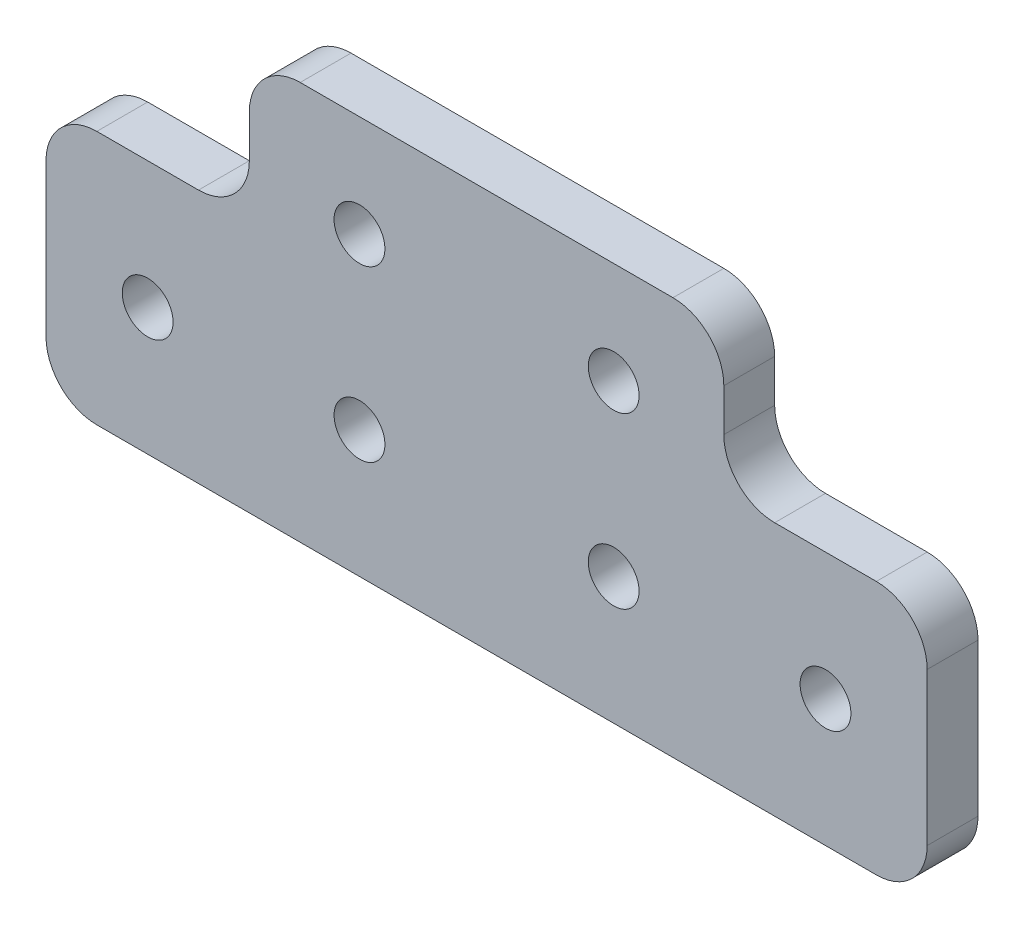
ISO-10303-21;
HEADER;
FILE_DESCRIPTION(('STEP AP214'),'2;1');
FILE_NAME('part.step','',(''),(''),'','','');
FILE_SCHEMA(('AUTOMOTIVE_DESIGN { 1 0 10303 214 1 1 1 1 }'));
ENDSEC;
DATA;
#1=APPLICATION_CONTEXT('core data for automotive mechanical design processes');
#2=APPLICATION_PROTOCOL_DEFINITION('international standard','automotive_design',2000,#1);
#3=PRODUCT_CONTEXT('',#1,'mechanical');
#4=PRODUCT('Part','Part','',(#3));
#5=PRODUCT_RELATED_PRODUCT_CATEGORY('part','',(#4));
#6=PRODUCT_DEFINITION_FORMATION('','',#4);
#7=PRODUCT_DEFINITION_CONTEXT('part definition',#1,'design');
#8=PRODUCT_DEFINITION('design','',#6,#7);
#9=PRODUCT_DEFINITION_SHAPE('','',#8);
#10=(LENGTH_UNIT() NAMED_UNIT(*) SI_UNIT(.MILLI.,.METRE.));
#11=(NAMED_UNIT(*) PLANE_ANGLE_UNIT() SI_UNIT($,.RADIAN.));
#12=(NAMED_UNIT(*) SI_UNIT($,.STERADIAN.) SOLID_ANGLE_UNIT());
#13=UNCERTAINTY_MEASURE_WITH_UNIT(LENGTH_MEASURE(1.E-05),#10,'distance_accuracy_value','');
#14=(GEOMETRIC_REPRESENTATION_CONTEXT(3) GLOBAL_UNCERTAINTY_ASSIGNED_CONTEXT((#13)) GLOBAL_UNIT_ASSIGNED_CONTEXT((#10,
#11,#12)) REPRESENTATION_CONTEXT('',''));
#15=CARTESIAN_POINT('',(0.,0.,0.));
#16=DIRECTION('',(0.,0.,1.));
#17=DIRECTION('',(1.,0.,0.));
#18=AXIS2_PLACEMENT_3D('',#15,#16,#17);
#19=CARTESIAN_POINT('',(0.,0.,3.));
#20=DIRECTION('',(0.,0.,1.));
#21=DIRECTION('',(1.,0.,0.));
#22=AXIS2_PLACEMENT_3D('',#19,#20,#21);
#23=PLANE('',#22);
#24=DIRECTION('',(1.,0.,0.));
#25=VECTOR('',#24,1.);
#26=CARTESIAN_POINT('',(26.,-12.5,3.));
#27=LINE('',#26,#25);
#28=CARTESIAN_POINT('',(-23.,-12.5,3.));
#29=VERTEX_POINT('',#28);
#30=CARTESIAN_POINT('',(23.,-12.5,3.));
#31=VERTEX_POINT('',#30);
#32=EDGE_CURVE('E160',#29,#31,#27,.T.);
#33=ORIENTED_EDGE('',*,*,#32,.T.);
#34=CARTESIAN_POINT('',(23.,-9.5,3.));
#35=DIRECTION('',(0.,0.,1.));
#36=DIRECTION('',(1.,0.,0.));
#37=AXIS2_PLACEMENT_3D('',#34,#35,#36);
#38=CIRCLE('',#37,3.);
#39=CARTESIAN_POINT('',(26.,-9.5,3.));
#40=VERTEX_POINT('',#39);
#41=EDGE_CURVE('E168',#31,#40,#38,.T.);
#42=ORIENTED_EDGE('',*,*,#41,.T.);
#43=DIRECTION('',(0.,1.,0.));
#44=VECTOR('',#43,1.);
#45=CARTESIAN_POINT('',(26.,2.5,3.));
#46=LINE('',#45,#44);
#47=CARTESIAN_POINT('',(26.,-0.499999999999999,3.));
#48=VERTEX_POINT('',#47);
#49=EDGE_CURVE('E349',#40,#48,#46,.T.);
#50=ORIENTED_EDGE('',*,*,#49,.T.);
#51=CARTESIAN_POINT('',(23.,-0.499999999999999,3.));
#52=DIRECTION('',(0.,0.,1.));
#53=DIRECTION('',(1.,0.,0.));
#54=AXIS2_PLACEMENT_3D('',#51,#52,#53);
#55=CIRCLE('',#54,3.);
#56=CARTESIAN_POINT('',(23.,2.5,3.));
#57=VERTEX_POINT('',#56);
#58=EDGE_CURVE('E204',#48,#57,#55,.T.);
#59=ORIENTED_EDGE('',*,*,#58,.T.);
#60=DIRECTION('',(-1.,0.,0.));
#61=VECTOR('',#60,1.);
#62=CARTESIAN_POINT('',(-26.,2.50000000000001,3.));
#63=LINE('',#62,#61);
#64=CARTESIAN_POINT('',(17.,2.5,3.));
#65=VERTEX_POINT('',#64);
#66=EDGE_CURVE('E307',#57,#65,#63,.T.);
#67=ORIENTED_EDGE('',*,*,#66,.T.);
#68=CARTESIAN_POINT('',(17.,5.5,3.));
#69=DIRECTION('',(0.,0.,1.));
#70=DIRECTION('',(1.,0.,0.));
#71=AXIS2_PLACEMENT_3D('',#68,#69,#70);
#72=CIRCLE('',#71,3.);
#73=CARTESIAN_POINT('',(14.,5.5,3.));
#74=VERTEX_POINT('',#73);
#75=EDGE_CURVE('E11',#65,#74,#72,.F.);
#76=ORIENTED_EDGE('',*,*,#75,.T.);
#77=DIRECTION('',(0.,1.,0.));
#78=VECTOR('',#77,1.);
#79=CARTESIAN_POINT('',(14.,11.,3.));
#80=LINE('',#79,#78);
#81=CARTESIAN_POINT('',(14.,8.,3.));
#82=VERTEX_POINT('',#81);
#83=EDGE_CURVE('E305',#74,#82,#80,.T.);
#84=ORIENTED_EDGE('',*,*,#83,.T.);
#85=CARTESIAN_POINT('',(11.,8.,3.));
#86=DIRECTION('',(0.,0.,1.));
#87=DIRECTION('',(1.,0.,0.));
#88=AXIS2_PLACEMENT_3D('',#85,#86,#87);
#89=CIRCLE('',#88,3.);
#90=CARTESIAN_POINT('',(11.,11.,3.));
#91=VERTEX_POINT('',#90);
#92=EDGE_CURVE('E201',#82,#91,#89,.T.);
#93=ORIENTED_EDGE('',*,*,#92,.T.);
#94=DIRECTION('',(-1.,0.,0.));
#95=VECTOR('',#94,1.);
#96=CARTESIAN_POINT('',(-14.,11.,3.));
#97=LINE('',#96,#95);
#98=CARTESIAN_POINT('',(-11.,11.,3.));
#99=VERTEX_POINT('',#98);
#100=EDGE_CURVE('E193',#91,#99,#97,.T.);
#101=ORIENTED_EDGE('',*,*,#100,.T.);
#102=CARTESIAN_POINT('',(-11.,8.,3.));
#103=DIRECTION('',(0.,0.,1.));
#104=DIRECTION('',(1.,0.,0.));
#105=AXIS2_PLACEMENT_3D('',#102,#103,#104);
#106=CIRCLE('',#105,3.);
#107=CARTESIAN_POINT('',(-14.,8.,3.));
#108=VERTEX_POINT('',#107);
#109=EDGE_CURVE('E190',#99,#108,#106,.T.);
#110=ORIENTED_EDGE('',*,*,#109,.T.);
#111=DIRECTION('',(0.,-1.,0.));
#112=VECTOR('',#111,1.);
#113=CARTESIAN_POINT('',(-14.,11.,3.));
#114=LINE('',#113,#112);
#115=CARTESIAN_POINT('',(-14.,5.50000000000001,3.));
#116=VERTEX_POINT('',#115);
#117=EDGE_CURVE('E186',#108,#116,#114,.T.);
#118=ORIENTED_EDGE('',*,*,#117,.T.);
#119=CARTESIAN_POINT('',(-17.,5.50000000000001,3.));
#120=DIRECTION('',(0.,0.,1.));
#121=DIRECTION('',(1.,0.,0.));
#122=AXIS2_PLACEMENT_3D('',#119,#120,#121);
#123=CIRCLE('',#122,3.);
#124=CARTESIAN_POINT('',(-17.,2.50000000000001,3.));
#125=VERTEX_POINT('',#124);
#126=EDGE_CURVE('E273',#116,#125,#123,.F.);
#127=ORIENTED_EDGE('',*,*,#126,.T.);
#128=CARTESIAN_POINT('',(-23.,2.50000000000001,3.));
#129=VERTEX_POINT('',#128);
#130=EDGE_CURVE('E342',#125,#129,#63,.T.);
#131=ORIENTED_EDGE('',*,*,#130,.T.);
#132=CARTESIAN_POINT('',(-23.,-0.499999999999994,3.));
#133=DIRECTION('',(0.,0.,1.));
#134=DIRECTION('',(1.,0.,0.));
#135=AXIS2_PLACEMENT_3D('',#132,#133,#134);
#136=CIRCLE('',#135,3.);
#137=CARTESIAN_POINT('',(-26.,-0.499999999999994,3.));
#138=VERTEX_POINT('',#137);
#139=EDGE_CURVE('E169',#129,#138,#136,.T.);
#140=ORIENTED_EDGE('',*,*,#139,.T.);
#141=DIRECTION('',(0.,-1.,0.));
#142=VECTOR('',#141,1.);
#143=CARTESIAN_POINT('',(-26.,-12.5,3.));
#144=LINE('',#143,#142);
#145=CARTESIAN_POINT('',(-26.,-9.50000000000001,3.));
#146=VERTEX_POINT('',#145);
#147=EDGE_CURVE('E162',#138,#146,#144,.T.);
#148=ORIENTED_EDGE('',*,*,#147,.T.);
#149=CARTESIAN_POINT('',(-23.,-9.50000000000001,3.));
#150=DIRECTION('',(0.,0.,1.));
#151=DIRECTION('',(1.,0.,0.));
#152=AXIS2_PLACEMENT_3D('',#149,#150,#151);
#153=CIRCLE('',#152,3.);
#154=EDGE_CURVE('E157',#146,#29,#153,.T.);
#155=ORIENTED_EDGE('',*,*,#154,.T.);
#156=EDGE_LOOP('',(#33,#42,#50,#59,#67,#76,#84,#93,#101,#110,#118,#127,#131,#140,#148,#155));
#157=FACE_BOUND('',#156,.T.);
#158=CARTESIAN_POINT('',(7.5,5.,3.));
#159=DIRECTION('',(0.,0.,1.));
#160=DIRECTION('',(1.,0.,0.));
#161=AXIS2_PLACEMENT_3D('',#158,#159,#160);
#162=CIRCLE('',#161,1.5);
#163=CARTESIAN_POINT('',(9.,5.,3.));
#164=VERTEX_POINT('',#163);
#165=EDGE_CURVE('E323',#164,#164,#162,.T.);
#166=ORIENTED_EDGE('',*,*,#165,.F.);
#167=EDGE_LOOP('',(#166));
#168=FACE_BOUND('',#167,.T.);
#169=CARTESIAN_POINT('',(-7.5,5.,3.));
#170=DIRECTION('',(0.,0.,1.));
#171=DIRECTION('',(-1.,0.,0.));
#172=AXIS2_PLACEMENT_3D('',#169,#170,#171);
#173=CIRCLE('',#172,1.5);
#174=CARTESIAN_POINT('',(-9.,5.,3.));
#175=VERTEX_POINT('',#174);
#176=EDGE_CURVE('E360',#175,#175,#173,.T.);
#177=ORIENTED_EDGE('',*,*,#176,.F.);
#178=EDGE_LOOP('',(#177));
#179=FACE_BOUND('',#178,.T.);
#180=CARTESIAN_POINT('',(7.5,-5.,3.));
#181=DIRECTION('',(0.,0.,1.));
#182=DIRECTION('',(-1.,0.,0.));
#183=AXIS2_PLACEMENT_3D('',#180,#181,#182);
#184=CIRCLE('',#183,1.5);
#185=CARTESIAN_POINT('',(6.,-5.,3.));
#186=VERTEX_POINT('',#185);
#187=EDGE_CURVE('E378',#186,#186,#184,.T.);
#188=ORIENTED_EDGE('',*,*,#187,.F.);
#189=EDGE_LOOP('',(#188));
#190=FACE_BOUND('',#189,.T.);
#191=CARTESIAN_POINT('',(-7.5,-5.,3.));
#192=DIRECTION('',(0.,0.,1.));
#193=DIRECTION('',(1.,0.,0.));
#194=AXIS2_PLACEMENT_3D('',#191,#192,#193);
#195=CIRCLE('',#194,1.5);
#196=CARTESIAN_POINT('',(-6.,-5.,3.));
#197=VERTEX_POINT('',#196);
#198=EDGE_CURVE('E370',#197,#197,#195,.T.);
#199=ORIENTED_EDGE('',*,*,#198,.F.);
#200=EDGE_LOOP('',(#199));
#201=FACE_BOUND('',#200,.T.);
#202=CARTESIAN_POINT('',(20.,-5.,3.));
#203=DIRECTION('',(0.,0.,1.));
#204=DIRECTION('',(1.,0.,0.));
#205=AXIS2_PLACEMENT_3D('',#202,#203,#204);
#206=CIRCLE('',#205,1.5);
#207=CARTESIAN_POINT('',(21.5,-5.,3.));
#208=VERTEX_POINT('',#207);
#209=EDGE_CURVE('E631',#208,#208,#206,.T.);
#210=ORIENTED_EDGE('',*,*,#209,.F.);
#211=EDGE_LOOP('',(#210));
#212=FACE_BOUND('',#211,.T.);
#213=CARTESIAN_POINT('',(-20.,-5.,3.));
#214=DIRECTION('',(0.,0.,1.));
#215=DIRECTION('',(-1.,0.,0.));
#216=AXIS2_PLACEMENT_3D('',#213,#214,#215);
#217=CIRCLE('',#216,1.5);
#218=CARTESIAN_POINT('',(-21.5,-5.,3.));
#219=VERTEX_POINT('',#218);
#220=EDGE_CURVE('E626',#219,#219,#217,.T.);
#221=ORIENTED_EDGE('',*,*,#220,.F.);
#222=EDGE_LOOP('',(#221));
#223=FACE_BOUND('',#222,.T.);
#224=ADVANCED_FACE('F42',(#157,#168,#179,#190,#201,#212,#223),#23,.T.);
#225=CARTESIAN_POINT('',(0.,0.,0.));
#226=DIRECTION('',(0.,0.,1.));
#227=DIRECTION('',(1.,0.,0.));
#228=AXIS2_PLACEMENT_3D('',#225,#226,#227);
#229=PLANE('',#228);
#230=DIRECTION('',(0.,1.,0.));
#231=VECTOR('',#230,1.);
#232=CARTESIAN_POINT('',(26.,2.5,0.));
#233=LINE('',#232,#231);
#234=CARTESIAN_POINT('',(26.,-9.5,0.));
#235=VERTEX_POINT('',#234);
#236=CARTESIAN_POINT('',(26.,-0.499999999999999,0.));
#237=VERTEX_POINT('',#236);
#238=EDGE_CURVE('E180',#235,#237,#233,.T.);
#239=ORIENTED_EDGE('',*,*,#238,.F.);
#240=CARTESIAN_POINT('',(23.,-9.5,0.));
#241=DIRECTION('',(0.,0.,1.));
#242=DIRECTION('',(1.,0.,0.));
#243=AXIS2_PLACEMENT_3D('',#240,#241,#242);
#244=CIRCLE('',#243,3.);
#245=CARTESIAN_POINT('',(23.,-12.5,0.));
#246=VERTEX_POINT('',#245);
#247=EDGE_CURVE('E230',#235,#246,#244,.F.);
#248=ORIENTED_EDGE('',*,*,#247,.T.);
#249=DIRECTION('',(1.,0.,0.));
#250=VECTOR('',#249,1.);
#251=CARTESIAN_POINT('',(26.,-12.5,0.));
#252=LINE('',#251,#250);
#253=CARTESIAN_POINT('',(-23.,-12.5,0.));
#254=VERTEX_POINT('',#253);
#255=EDGE_CURVE('E369',#254,#246,#252,.T.);
#256=ORIENTED_EDGE('',*,*,#255,.F.);
#257=CARTESIAN_POINT('',(-23.,-9.50000000000001,0.));
#258=DIRECTION('',(0.,0.,1.));
#259=DIRECTION('',(1.,0.,0.));
#260=AXIS2_PLACEMENT_3D('',#257,#258,#259);
#261=CIRCLE('',#260,3.);
#262=CARTESIAN_POINT('',(-26.,-9.50000000000001,0.));
#263=VERTEX_POINT('',#262);
#264=EDGE_CURVE('E184',#254,#263,#261,.F.);
#265=ORIENTED_EDGE('',*,*,#264,.T.);
#266=DIRECTION('',(0.,-1.,0.));
#267=VECTOR('',#266,1.);
#268=CARTESIAN_POINT('',(-26.,-12.5,0.));
#269=LINE('',#268,#267);
#270=CARTESIAN_POINT('',(-26.,-0.499999999999994,0.));
#271=VERTEX_POINT('',#270);
#272=EDGE_CURVE('E298',#271,#263,#269,.T.);
#273=ORIENTED_EDGE('',*,*,#272,.F.);
#274=CARTESIAN_POINT('',(-23.,-0.499999999999994,0.));
#275=DIRECTION('',(0.,0.,1.));
#276=DIRECTION('',(1.,0.,0.));
#277=AXIS2_PLACEMENT_3D('',#274,#275,#276);
#278=CIRCLE('',#277,3.);
#279=CARTESIAN_POINT('',(-23.,2.50000000000001,0.));
#280=VERTEX_POINT('',#279);
#281=EDGE_CURVE('E225',#271,#280,#278,.F.);
#282=ORIENTED_EDGE('',*,*,#281,.T.);
#283=DIRECTION('',(-1.,0.,0.));
#284=VECTOR('',#283,1.);
#285=CARTESIAN_POINT('',(-26.,2.50000000000001,0.));
#286=LINE('',#285,#284);
#287=CARTESIAN_POINT('',(-17.,2.50000000000001,0.));
#288=VERTEX_POINT('',#287);
#289=EDGE_CURVE('E299',#288,#280,#286,.T.);
#290=ORIENTED_EDGE('',*,*,#289,.F.);
#291=CARTESIAN_POINT('',(-17.,5.50000000000001,0.));
#292=DIRECTION('',(0.,0.,1.));
#293=DIRECTION('',(1.,0.,0.));
#294=AXIS2_PLACEMENT_3D('',#291,#292,#293);
#295=CIRCLE('',#294,3.);
#296=CARTESIAN_POINT('',(-14.,5.50000000000001,0.));
#297=VERTEX_POINT('',#296);
#298=EDGE_CURVE('E276',#288,#297,#295,.T.);
#299=ORIENTED_EDGE('',*,*,#298,.T.);
#300=DIRECTION('',(0.,-1.,0.));
#301=VECTOR('',#300,1.);
#302=CARTESIAN_POINT('',(-14.,11.,0.));
#303=LINE('',#302,#301);
#304=CARTESIAN_POINT('',(-14.,8.,0.));
#305=VERTEX_POINT('',#304);
#306=EDGE_CURVE('E196',#305,#297,#303,.T.);
#307=ORIENTED_EDGE('',*,*,#306,.F.);
#308=CARTESIAN_POINT('',(-11.,8.,0.));
#309=DIRECTION('',(0.,0.,1.));
#310=DIRECTION('',(1.,0.,0.));
#311=AXIS2_PLACEMENT_3D('',#308,#309,#310);
#312=CIRCLE('',#311,3.);
#313=CARTESIAN_POINT('',(-11.,11.,0.));
#314=VERTEX_POINT('',#313);
#315=EDGE_CURVE('E58',#305,#314,#312,.F.);
#316=ORIENTED_EDGE('',*,*,#315,.T.);
#317=DIRECTION('',(-1.,0.,0.));
#318=VECTOR('',#317,1.);
#319=CARTESIAN_POINT('',(-14.,11.,0.));
#320=LINE('',#319,#318);
#321=CARTESIAN_POINT('',(11.,11.,0.));
#322=VERTEX_POINT('',#321);
#323=EDGE_CURVE('E317',#322,#314,#320,.T.);
#324=ORIENTED_EDGE('',*,*,#323,.F.);
#325=CARTESIAN_POINT('',(11.,8.,0.));
#326=DIRECTION('',(0.,0.,1.));
#327=DIRECTION('',(1.,0.,0.));
#328=AXIS2_PLACEMENT_3D('',#325,#326,#327);
#329=CIRCLE('',#328,3.);
#330=CARTESIAN_POINT('',(14.,8.,0.));
#331=VERTEX_POINT('',#330);
#332=EDGE_CURVE('E66',#322,#331,#329,.F.);
#333=ORIENTED_EDGE('',*,*,#332,.T.);
#334=DIRECTION('',(0.,1.,0.));
#335=VECTOR('',#334,1.);
#336=CARTESIAN_POINT('',(14.,11.,0.));
#337=LINE('',#336,#335);
#338=CARTESIAN_POINT('',(14.,5.5,0.));
#339=VERTEX_POINT('',#338);
#340=EDGE_CURVE('E288',#339,#331,#337,.T.);
#341=ORIENTED_EDGE('',*,*,#340,.F.);
#342=CARTESIAN_POINT('',(17.,5.5,0.));
#343=DIRECTION('',(0.,0.,1.));
#344=DIRECTION('',(1.,0.,0.));
#345=AXIS2_PLACEMENT_3D('',#342,#343,#344);
#346=CIRCLE('',#345,3.);
#347=CARTESIAN_POINT('',(17.,2.5,0.));
#348=VERTEX_POINT('',#347);
#349=EDGE_CURVE('E51',#339,#348,#346,.T.);
#350=ORIENTED_EDGE('',*,*,#349,.T.);
#351=CARTESIAN_POINT('',(23.,2.5,0.));
#352=VERTEX_POINT('',#351);
#353=EDGE_CURVE('E285',#352,#348,#286,.T.);
#354=ORIENTED_EDGE('',*,*,#353,.F.);
#355=CARTESIAN_POINT('',(23.,-0.499999999999999,0.));
#356=DIRECTION('',(0.,0.,1.));
#357=DIRECTION('',(1.,0.,0.));
#358=AXIS2_PLACEMENT_3D('',#355,#356,#357);
#359=CIRCLE('',#358,3.);
#360=EDGE_CURVE('E222',#352,#237,#359,.F.);
#361=ORIENTED_EDGE('',*,*,#360,.T.);
#362=EDGE_LOOP('',(#239,#248,#256,#265,#273,#282,#290,#299,#307,#316,#324,#333,#341,#350,#354,#361));
#363=FACE_BOUND('',#362,.T.);
#364=CARTESIAN_POINT('',(7.5,5.,0.));
#365=DIRECTION('',(0.,0.,1.));
#366=DIRECTION('',(1.,0.,0.));
#367=AXIS2_PLACEMENT_3D('',#364,#365,#366);
#368=CIRCLE('',#367,1.5);
#369=CARTESIAN_POINT('',(9.,5.,0.));
#370=VERTEX_POINT('',#369);
#371=EDGE_CURVE('E319',#370,#370,#368,.T.);
#372=ORIENTED_EDGE('',*,*,#371,.T.);
#373=EDGE_LOOP('',(#372));
#374=FACE_BOUND('',#373,.T.);
#375=CARTESIAN_POINT('',(-7.5,5.,0.));
#376=DIRECTION('',(0.,0.,1.));
#377=DIRECTION('',(-1.,0.,0.));
#378=AXIS2_PLACEMENT_3D('',#375,#376,#377);
#379=CIRCLE('',#378,1.5);
#380=CARTESIAN_POINT('',(-9.,5.,0.));
#381=VERTEX_POINT('',#380);
#382=EDGE_CURVE('E365',#381,#381,#379,.T.);
#383=ORIENTED_EDGE('',*,*,#382,.T.);
#384=EDGE_LOOP('',(#383));
#385=FACE_BOUND('',#384,.T.);
#386=CARTESIAN_POINT('',(-7.5,-5.,0.));
#387=DIRECTION('',(0.,0.,1.));
#388=DIRECTION('',(1.,0.,0.));
#389=AXIS2_PLACEMENT_3D('',#386,#387,#388);
#390=CIRCLE('',#389,1.5);
#391=CARTESIAN_POINT('',(-6.,-5.,0.));
#392=VERTEX_POINT('',#391);
#393=EDGE_CURVE('E364',#392,#392,#390,.T.);
#394=ORIENTED_EDGE('',*,*,#393,.T.);
#395=EDGE_LOOP('',(#394));
#396=FACE_BOUND('',#395,.T.);
#397=CARTESIAN_POINT('',(7.5,-5.,0.));
#398=DIRECTION('',(0.,0.,1.));
#399=DIRECTION('',(-1.,0.,0.));
#400=AXIS2_PLACEMENT_3D('',#397,#398,#399);
#401=CIRCLE('',#400,1.5);
#402=CARTESIAN_POINT('',(6.,-5.,0.));
#403=VERTEX_POINT('',#402);
#404=EDGE_CURVE('E374',#403,#403,#401,.T.);
#405=ORIENTED_EDGE('',*,*,#404,.T.);
#406=EDGE_LOOP('',(#405));
#407=FACE_BOUND('',#406,.T.);
#408=CARTESIAN_POINT('',(20.,-5.,0.));
#409=DIRECTION('',(0.,0.,1.));
#410=DIRECTION('',(1.,0.,0.));
#411=AXIS2_PLACEMENT_3D('',#408,#409,#410);
#412=CIRCLE('',#411,1.5);
#413=CARTESIAN_POINT('',(21.5,-5.,0.));
#414=VERTEX_POINT('',#413);
#415=EDGE_CURVE('E354',#414,#414,#412,.T.);
#416=ORIENTED_EDGE('',*,*,#415,.T.);
#417=EDGE_LOOP('',(#416));
#418=FACE_BOUND('',#417,.T.);
#419=CARTESIAN_POINT('',(-20.,-5.,0.));
#420=DIRECTION('',(0.,0.,1.));
#421=DIRECTION('',(-1.,0.,0.));
#422=AXIS2_PLACEMENT_3D('',#419,#420,#421);
#423=CIRCLE('',#422,1.5);
#424=CARTESIAN_POINT('',(-21.5,-5.,0.));
#425=VERTEX_POINT('',#424);
#426=EDGE_CURVE('E623',#425,#425,#423,.T.);
#427=ORIENTED_EDGE('',*,*,#426,.T.);
#428=EDGE_LOOP('',(#427));
#429=FACE_BOUND('',#428,.T.);
#430=ADVANCED_FACE('F283',(#363,#374,#385,#396,#407,#418,#429),#229,.F.);
#431=CARTESIAN_POINT('',(14.,11.,3.));
#432=DIRECTION('',(-1.,0.,0.));
#433=DIRECTION('',(0.,0.,1.));
#434=AXIS2_PLACEMENT_3D('',#431,#432,#433);
#435=PLANE('',#434);
#436=ORIENTED_EDGE('',*,*,#83,.F.);
#437=DIRECTION('',(0.,0.,-1.));
#438=VECTOR('',#437,1.);
#439=CARTESIAN_POINT('',(14.,5.5,3.));
#440=LINE('',#439,#438);
#441=EDGE_CURVE('E257',#74,#339,#440,.T.);
#442=ORIENTED_EDGE('',*,*,#441,.T.);
#443=ORIENTED_EDGE('',*,*,#340,.T.);
#444=DIRECTION('',(0.,0.,-1.));
#445=VECTOR('',#444,1.);
#446=CARTESIAN_POINT('',(14.,8.,3.));
#447=LINE('',#446,#445);
#448=EDGE_CURVE('E254',#331,#82,#447,.F.);
#449=ORIENTED_EDGE('',*,*,#448,.T.);
#450=EDGE_LOOP('',(#436,#442,#443,#449));
#451=FACE_BOUND('',#450,.T.);
#452=ADVANCED_FACE('F309',(#451),#435,.F.);
#453=CARTESIAN_POINT('',(-14.,11.,3.));
#454=DIRECTION('',(0.,-1.,0.));
#455=DIRECTION('',(0.,0.,-1.));
#456=AXIS2_PLACEMENT_3D('',#453,#454,#455);
#457=PLANE('',#456);
#458=ORIENTED_EDGE('',*,*,#100,.F.);
#459=DIRECTION('',(0.,0.,-1.));
#460=VECTOR('',#459,1.);
#461=CARTESIAN_POINT('',(11.,11.,3.));
#462=LINE('',#461,#460);
#463=EDGE_CURVE('E270',#91,#322,#462,.T.);
#464=ORIENTED_EDGE('',*,*,#463,.T.);
#465=ORIENTED_EDGE('',*,*,#323,.T.);
#466=DIRECTION('',(0.,0.,-1.));
#467=VECTOR('',#466,1.);
#468=CARTESIAN_POINT('',(-11.,11.,3.));
#469=LINE('',#468,#467);
#470=EDGE_CURVE('E267',#314,#99,#469,.F.);
#471=ORIENTED_EDGE('',*,*,#470,.T.);
#472=EDGE_LOOP('',(#458,#464,#465,#471));
#473=FACE_BOUND('',#472,.T.);
#474=ADVANCED_FACE('F328',(#473),#457,.F.);
#475=CARTESIAN_POINT('',(-14.,11.,3.));
#476=DIRECTION('',(1.,0.,0.));
#477=DIRECTION('',(0.,0.,-1.));
#478=AXIS2_PLACEMENT_3D('',#475,#476,#477);
#479=PLANE('',#478);
#480=ORIENTED_EDGE('',*,*,#306,.T.);
#481=DIRECTION('',(0.,0.,1.));
#482=VECTOR('',#481,1.);
#483=CARTESIAN_POINT('',(-14.,5.50000000000001,3.));
#484=LINE('',#483,#482);
#485=EDGE_CURVE('E250',#297,#116,#484,.T.);
#486=ORIENTED_EDGE('',*,*,#485,.T.);
#487=ORIENTED_EDGE('',*,*,#117,.F.);
#488=DIRECTION('',(0.,0.,-1.));
#489=VECTOR('',#488,1.);
#490=CARTESIAN_POINT('',(-14.,8.,3.));
#491=LINE('',#490,#489);
#492=EDGE_CURVE('E246',#108,#305,#491,.T.);
#493=ORIENTED_EDGE('',*,*,#492,.T.);
#494=EDGE_LOOP('',(#480,#486,#487,#493));
#495=FACE_BOUND('',#494,.T.);
#496=ADVANCED_FACE('F334',(#495),#479,.F.);
#497=CARTESIAN_POINT('',(7.5,5.,3.));
#498=DIRECTION('',(0.,0.,-1.));
#499=DIRECTION('',(-1.,0.,0.));
#500=AXIS2_PLACEMENT_3D('',#497,#498,#499);
#501=CYLINDRICAL_SURFACE('',#500,1.5);
#502=ORIENTED_EDGE('',*,*,#165,.T.);
#503=EDGE_LOOP('',(#502));
#504=FACE_BOUND('',#503,.T.);
#505=ORIENTED_EDGE('',*,*,#371,.F.);
#506=EDGE_LOOP('',(#505));
#507=FACE_BOUND('',#506,.T.);
#508=ADVANCED_FACE('F393',(#504,#507),#501,.F.);
#509=CARTESIAN_POINT('',(7.5,-5.,3.));
#510=DIRECTION('',(0.,0.,-1.));
#511=DIRECTION('',(-1.,0.,0.));
#512=AXIS2_PLACEMENT_3D('',#509,#510,#511);
#513=CYLINDRICAL_SURFACE('',#512,1.5);
#514=ORIENTED_EDGE('',*,*,#187,.T.);
#515=EDGE_LOOP('',(#514));
#516=FACE_BOUND('',#515,.T.);
#517=ORIENTED_EDGE('',*,*,#404,.F.);
#518=EDGE_LOOP('',(#517));
#519=FACE_BOUND('',#518,.T.);
#520=ADVANCED_FACE('F395',(#516,#519),#513,.F.);
#521=CARTESIAN_POINT('',(-7.5,-5.,3.));
#522=DIRECTION('',(0.,0.,-1.));
#523=DIRECTION('',(-1.,0.,0.));
#524=AXIS2_PLACEMENT_3D('',#521,#522,#523);
#525=CYLINDRICAL_SURFACE('',#524,1.5);
#526=ORIENTED_EDGE('',*,*,#198,.T.);
#527=EDGE_LOOP('',(#526));
#528=FACE_BOUND('',#527,.T.);
#529=ORIENTED_EDGE('',*,*,#393,.F.);
#530=EDGE_LOOP('',(#529));
#531=FACE_BOUND('',#530,.T.);
#532=ADVANCED_FACE('F401',(#528,#531),#525,.F.);
#533=CARTESIAN_POINT('',(-7.5,5.,3.));
#534=DIRECTION('',(0.,0.,-1.));
#535=DIRECTION('',(-1.,0.,0.));
#536=AXIS2_PLACEMENT_3D('',#533,#534,#535);
#537=CYLINDRICAL_SURFACE('',#536,1.5);
#538=ORIENTED_EDGE('',*,*,#176,.T.);
#539=EDGE_LOOP('',(#538));
#540=FACE_BOUND('',#539,.T.);
#541=ORIENTED_EDGE('',*,*,#382,.F.);
#542=EDGE_LOOP('',(#541));
#543=FACE_BOUND('',#542,.T.);
#544=ADVANCED_FACE('F530',(#540,#543),#537,.F.);
#545=CARTESIAN_POINT('',(-26.,2.50000000000001,0.));
#546=DIRECTION('',(0.,1.,0.));
#547=DIRECTION('',(-1.,0.,0.));
#548=AXIS2_PLACEMENT_3D('',#545,#546,#547);
#549=PLANE('',#548);
#550=ORIENTED_EDGE('',*,*,#353,.T.);
#551=DIRECTION('',(0.,0.,-1.));
#552=VECTOR('',#551,1.);
#553=CARTESIAN_POINT('',(17.,2.5,0.));
#554=LINE('',#553,#552);
#555=EDGE_CURVE('E264',#348,#65,#554,.F.);
#556=ORIENTED_EDGE('',*,*,#555,.T.);
#557=ORIENTED_EDGE('',*,*,#66,.F.);
#558=DIRECTION('',(0.,0.,1.));
#559=VECTOR('',#558,1.);
#560=CARTESIAN_POINT('',(23.,2.5,0.));
#561=LINE('',#560,#559);
#562=EDGE_CURVE('E261',#57,#352,#561,.F.);
#563=ORIENTED_EDGE('',*,*,#562,.T.);
#564=EDGE_LOOP('',(#550,#556,#557,#563));
#565=FACE_BOUND('',#564,.T.);
#566=ADVANCED_FACE('F293',(#565),#549,.T.);
#567=ORIENTED_EDGE('',*,*,#289,.T.);
#568=DIRECTION('',(0.,0.,1.));
#569=VECTOR('',#568,1.);
#570=CARTESIAN_POINT('',(-23.,2.50000000000001,0.));
#571=LINE('',#570,#569);
#572=EDGE_CURVE('E242',#280,#129,#571,.T.);
#573=ORIENTED_EDGE('',*,*,#572,.T.);
#574=ORIENTED_EDGE('',*,*,#130,.F.);
#575=DIRECTION('',(0.,0.,1.));
#576=VECTOR('',#575,1.);
#577=CARTESIAN_POINT('',(-17.,2.50000000000001,0.));
#578=LINE('',#577,#576);
#579=EDGE_CURVE('E239',#125,#288,#578,.F.);
#580=ORIENTED_EDGE('',*,*,#579,.T.);
#581=EDGE_LOOP('',(#567,#573,#574,#580));
#582=FACE_BOUND('',#581,.T.);
#583=ADVANCED_FACE('F345',(#582),#549,.T.);
#584=CARTESIAN_POINT('',(26.,2.5,0.));
#585=DIRECTION('',(1.,0.,0.));
#586=DIRECTION('',(0.,0.,-1.));
#587=AXIS2_PLACEMENT_3D('',#584,#585,#586);
#588=PLANE('',#587);
#589=ORIENTED_EDGE('',*,*,#49,.F.);
#590=DIRECTION('',(0.,0.,1.));
#591=VECTOR('',#590,1.);
#592=CARTESIAN_POINT('',(26.,-9.5,0.));
#593=LINE('',#592,#591);
#594=EDGE_CURVE('E215',#40,#235,#593,.F.);
#595=ORIENTED_EDGE('',*,*,#594,.T.);
#596=ORIENTED_EDGE('',*,*,#238,.T.);
#597=DIRECTION('',(0.,0.,1.));
#598=VECTOR('',#597,1.);
#599=CARTESIAN_POINT('',(26.,-0.499999999999999,0.));
#600=LINE('',#599,#598);
#601=EDGE_CURVE('E211',#237,#48,#600,.T.);
#602=ORIENTED_EDGE('',*,*,#601,.T.);
#603=EDGE_LOOP('',(#589,#595,#596,#602));
#604=FACE_BOUND('',#603,.T.);
#605=ADVANCED_FACE('F511',(#604),#588,.T.);
#606=CARTESIAN_POINT('',(26.,-12.5,0.));
#607=DIRECTION('',(0.,-1.,0.));
#608=DIRECTION('',(1.,0.,0.));
#609=AXIS2_PLACEMENT_3D('',#606,#607,#608);
#610=PLANE('',#609);
#611=ORIENTED_EDGE('',*,*,#255,.T.);
#612=DIRECTION('',(0.,0.,1.));
#613=VECTOR('',#612,1.);
#614=CARTESIAN_POINT('',(23.,-12.5,0.));
#615=LINE('',#614,#613);
#616=EDGE_CURVE('E178',#246,#31,#615,.T.);
#617=ORIENTED_EDGE('',*,*,#616,.T.);
#618=ORIENTED_EDGE('',*,*,#32,.F.);
#619=DIRECTION('',(0.,0.,1.));
#620=VECTOR('',#619,1.);
#621=CARTESIAN_POINT('',(-23.,-12.5,0.));
#622=LINE('',#621,#620);
#623=EDGE_CURVE('E175',#29,#254,#622,.F.);
#624=ORIENTED_EDGE('',*,*,#623,.T.);
#625=EDGE_LOOP('',(#611,#617,#618,#624));
#626=FACE_BOUND('',#625,.T.);
#627=ADVANCED_FACE('F174',(#626),#610,.T.);
#628=CARTESIAN_POINT('',(-26.,-12.5,0.));
#629=DIRECTION('',(-1.,0.,0.));
#630=DIRECTION('',(0.,0.,1.));
#631=AXIS2_PLACEMENT_3D('',#628,#629,#630);
#632=PLANE('',#631);
#633=ORIENTED_EDGE('',*,*,#272,.T.);
#634=DIRECTION('',(0.,0.,1.));
#635=VECTOR('',#634,1.);
#636=CARTESIAN_POINT('',(-26.,-9.50000000000001,0.));
#637=LINE('',#636,#635);
#638=EDGE_CURVE('E236',#263,#146,#637,.T.);
#639=ORIENTED_EDGE('',*,*,#638,.T.);
#640=ORIENTED_EDGE('',*,*,#147,.F.);
#641=DIRECTION('',(0.,0.,1.));
#642=VECTOR('',#641,1.);
#643=CARTESIAN_POINT('',(-26.,-0.499999999999994,0.));
#644=LINE('',#643,#642);
#645=EDGE_CURVE('E233',#138,#271,#644,.F.);
#646=ORIENTED_EDGE('',*,*,#645,.T.);
#647=EDGE_LOOP('',(#633,#639,#640,#646));
#648=FACE_BOUND('',#647,.T.);
#649=ADVANCED_FACE('F498',(#648),#632,.T.);
#650=CARTESIAN_POINT('',(20.,-5.,0.));
#651=DIRECTION('',(0.,0.,1.));
#652=DIRECTION('',(1.,0.,0.));
#653=AXIS2_PLACEMENT_3D('',#650,#651,#652);
#654=CYLINDRICAL_SURFACE('',#653,1.5);
#655=ORIENTED_EDGE('',*,*,#415,.F.);
#656=EDGE_LOOP('',(#655));
#657=FACE_BOUND('',#656,.T.);
#658=ORIENTED_EDGE('',*,*,#209,.T.);
#659=EDGE_LOOP('',(#658));
#660=FACE_BOUND('',#659,.T.);
#661=ADVANCED_FACE('F502',(#657,#660),#654,.F.);
#662=CARTESIAN_POINT('',(-20.,-5.,0.));
#663=DIRECTION('',(0.,0.,1.));
#664=DIRECTION('',(1.,0.,0.));
#665=AXIS2_PLACEMENT_3D('',#662,#663,#664);
#666=CYLINDRICAL_SURFACE('',#665,1.5);
#667=ORIENTED_EDGE('',*,*,#426,.F.);
#668=EDGE_LOOP('',(#667));
#669=FACE_BOUND('',#668,.T.);
#670=ORIENTED_EDGE('',*,*,#220,.T.);
#671=EDGE_LOOP('',(#670));
#672=FACE_BOUND('',#671,.T.);
#673=ADVANCED_FACE('F421',(#669,#672),#666,.F.);
#674=CARTESIAN_POINT('',(23.,-9.5,0.));
#675=DIRECTION('',(0.,0.,1.));
#676=DIRECTION('',(1.,0.,0.));
#677=AXIS2_PLACEMENT_3D('',#674,#675,#676);
#678=CYLINDRICAL_SURFACE('',#677,3.);
#679=ORIENTED_EDGE('',*,*,#247,.F.);
#680=ORIENTED_EDGE('',*,*,#594,.F.);
#681=ORIENTED_EDGE('',*,*,#41,.F.);
#682=ORIENTED_EDGE('',*,*,#616,.F.);
#683=EDGE_LOOP('',(#679,#680,#681,#682));
#684=FACE_BOUND('',#683,.T.);
#685=ADVANCED_FACE('F418',(#684),#678,.T.);
#686=CARTESIAN_POINT('',(-23.,-9.50000000000001,0.));
#687=DIRECTION('',(0.,0.,1.));
#688=DIRECTION('',(1.,0.,0.));
#689=AXIS2_PLACEMENT_3D('',#686,#687,#688);
#690=CYLINDRICAL_SURFACE('',#689,3.);
#691=ORIENTED_EDGE('',*,*,#264,.F.);
#692=ORIENTED_EDGE('',*,*,#623,.F.);
#693=ORIENTED_EDGE('',*,*,#154,.F.);
#694=ORIENTED_EDGE('',*,*,#638,.F.);
#695=EDGE_LOOP('',(#691,#692,#693,#694));
#696=FACE_BOUND('',#695,.T.);
#697=ADVANCED_FACE('F183',(#696),#690,.T.);
#698=CARTESIAN_POINT('',(-23.,-0.499999999999994,0.));
#699=DIRECTION('',(0.,0.,1.));
#700=DIRECTION('',(1.,0.,0.));
#701=AXIS2_PLACEMENT_3D('',#698,#699,#700);
#702=CYLINDRICAL_SURFACE('',#701,3.);
#703=ORIENTED_EDGE('',*,*,#281,.F.);
#704=ORIENTED_EDGE('',*,*,#645,.F.);
#705=ORIENTED_EDGE('',*,*,#139,.F.);
#706=ORIENTED_EDGE('',*,*,#572,.F.);
#707=EDGE_LOOP('',(#703,#704,#705,#706));
#708=FACE_BOUND('',#707,.T.);
#709=ADVANCED_FACE('F425',(#708),#702,.T.);
#710=CARTESIAN_POINT('',(-17.,5.50000000000001,3.));
#711=DIRECTION('',(0.,0.,1.));
#712=DIRECTION('',(1.,0.,0.));
#713=AXIS2_PLACEMENT_3D('',#710,#711,#712);
#714=CYLINDRICAL_SURFACE('',#713,3.);
#715=ORIENTED_EDGE('',*,*,#298,.F.);
#716=ORIENTED_EDGE('',*,*,#579,.F.);
#717=ORIENTED_EDGE('',*,*,#126,.F.);
#718=ORIENTED_EDGE('',*,*,#485,.F.);
#719=EDGE_LOOP('',(#715,#716,#717,#718));
#720=FACE_BOUND('',#719,.T.);
#721=ADVANCED_FACE('F338',(#720),#714,.F.);
#722=CARTESIAN_POINT('',(17.,5.5,3.));
#723=DIRECTION('',(0.,0.,-1.));
#724=DIRECTION('',(-1.,0.,0.));
#725=AXIS2_PLACEMENT_3D('',#722,#723,#724);
#726=CYLINDRICAL_SURFACE('',#725,3.);
#727=ORIENTED_EDGE('',*,*,#75,.F.);
#728=ORIENTED_EDGE('',*,*,#555,.F.);
#729=ORIENTED_EDGE('',*,*,#349,.F.);
#730=ORIENTED_EDGE('',*,*,#441,.F.);
#731=EDGE_LOOP('',(#727,#728,#729,#730));
#732=FACE_BOUND('',#731,.T.);
#733=ADVANCED_FACE('F302',(#732),#726,.F.);
#734=CARTESIAN_POINT('',(23.,-0.499999999999999,0.));
#735=DIRECTION('',(0.,0.,1.));
#736=DIRECTION('',(1.,0.,0.));
#737=AXIS2_PLACEMENT_3D('',#734,#735,#736);
#738=CYLINDRICAL_SURFACE('',#737,3.);
#739=ORIENTED_EDGE('',*,*,#360,.F.);
#740=ORIENTED_EDGE('',*,*,#562,.F.);
#741=ORIENTED_EDGE('',*,*,#58,.F.);
#742=ORIENTED_EDGE('',*,*,#601,.F.);
#743=EDGE_LOOP('',(#739,#740,#741,#742));
#744=FACE_BOUND('',#743,.T.);
#745=ADVANCED_FACE('F433',(#744),#738,.T.);
#746=CARTESIAN_POINT('',(11.,8.,3.));
#747=DIRECTION('',(0.,0.,-1.));
#748=DIRECTION('',(-1.,0.,0.));
#749=AXIS2_PLACEMENT_3D('',#746,#747,#748);
#750=CYLINDRICAL_SURFACE('',#749,3.);
#751=ORIENTED_EDGE('',*,*,#92,.F.);
#752=ORIENTED_EDGE('',*,*,#448,.F.);
#753=ORIENTED_EDGE('',*,*,#332,.F.);
#754=ORIENTED_EDGE('',*,*,#463,.F.);
#755=EDGE_LOOP('',(#751,#752,#753,#754));
#756=FACE_BOUND('',#755,.T.);
#757=ADVANCED_FACE('F435',(#756),#750,.T.);
#758=CARTESIAN_POINT('',(-11.,8.,3.));
#759=DIRECTION('',(0.,0.,-1.));
#760=DIRECTION('',(-1.,0.,0.));
#761=AXIS2_PLACEMENT_3D('',#758,#759,#760);
#762=CYLINDRICAL_SURFACE('',#761,3.);
#763=ORIENTED_EDGE('',*,*,#109,.F.);
#764=ORIENTED_EDGE('',*,*,#470,.F.);
#765=ORIENTED_EDGE('',*,*,#315,.F.);
#766=ORIENTED_EDGE('',*,*,#492,.F.);
#767=EDGE_LOOP('',(#763,#764,#765,#766));
#768=FACE_BOUND('',#767,.T.);
#769=ADVANCED_FACE('F44',(#768),#762,.T.);
#770=CLOSED_SHELL('',(#224,#430,#452,#474,#496,#508,#520,#532,#544,#566,#583,#605,#627,#649,
#661,#673,#685,#697,#709,#721,#733,#745,#757,#769));
#771=MANIFOLD_SOLID_BREP('B2',#770);
#772=ADVANCED_BREP_SHAPE_REPRESENTATION('',(#18,#771),#14);
#773=SHAPE_DEFINITION_REPRESENTATION(#9,#772);
ENDSEC;
END-ISO-10303-21;
